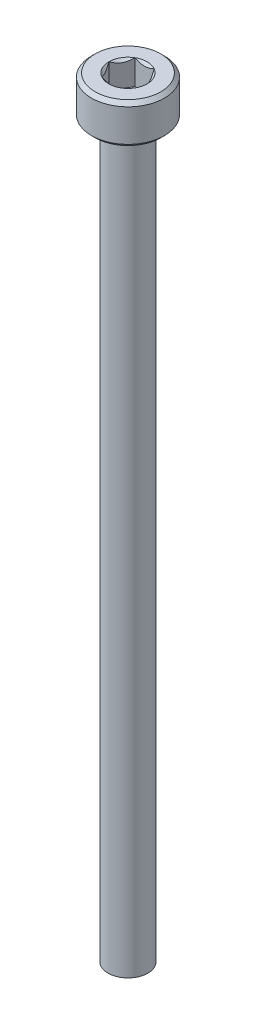
ISO-10303-21;
HEADER;
FILE_DESCRIPTION(('STEP AP214'),'2;1');
FILE_NAME('part.step','',(''),(''),'','','');
FILE_SCHEMA(('AUTOMOTIVE_DESIGN { 1 0 10303 214 1 1 1 1 }'));
ENDSEC;
DATA;
#1=APPLICATION_CONTEXT('core data for automotive mechanical design processes');
#2=APPLICATION_PROTOCOL_DEFINITION('international standard','automotive_design',2000,#1);
#3=PRODUCT_CONTEXT('',#1,'mechanical');
#4=PRODUCT('Part','Part','',(#3));
#5=PRODUCT_RELATED_PRODUCT_CATEGORY('part','',(#4));
#6=PRODUCT_DEFINITION_FORMATION('','',#4);
#7=PRODUCT_DEFINITION_CONTEXT('part definition',#1,'design');
#8=PRODUCT_DEFINITION('design','',#6,#7);
#9=PRODUCT_DEFINITION_SHAPE('','',#8);
#10=(LENGTH_UNIT() NAMED_UNIT(*) SI_UNIT(.MILLI.,.METRE.));
#11=(NAMED_UNIT(*) PLANE_ANGLE_UNIT() SI_UNIT($,.RADIAN.));
#12=(NAMED_UNIT(*) SI_UNIT($,.STERADIAN.) SOLID_ANGLE_UNIT());
#13=UNCERTAINTY_MEASURE_WITH_UNIT(LENGTH_MEASURE(1.E-05),#10,'distance_accuracy_value','');
#14=(GEOMETRIC_REPRESENTATION_CONTEXT(3) GLOBAL_UNCERTAINTY_ASSIGNED_CONTEXT((#13)) GLOBAL_UNIT_ASSIGNED_CONTEXT((#10,
#11,#12)) REPRESENTATION_CONTEXT('',''));
#15=CARTESIAN_POINT('',(0.,0.,0.));
#16=DIRECTION('',(0.,0.,1.));
#17=DIRECTION('',(1.,0.,0.));
#18=AXIS2_PLACEMENT_3D('',#15,#16,#17);
#19=CARTESIAN_POINT('',(0.,3.,0.));
#20=DIRECTION('',(0.,-1.,0.));
#21=DIRECTION('',(0.,0.,-1.));
#22=AXIS2_PLACEMENT_3D('',#19,#20,#21);
#23=CYLINDRICAL_SURFACE('',#22,2.75);
#24=CARTESIAN_POINT('',(0.,0.275000000000001,0.));
#25=DIRECTION('',(0.,1.,0.));
#26=DIRECTION('',(0.,0.,1.));
#27=AXIS2_PLACEMENT_3D('',#24,#25,#26);
#28=CIRCLE('',#27,2.75);
#29=CARTESIAN_POINT('',(0.,0.275000000000001,2.75));
#30=VERTEX_POINT('',#29);
#31=EDGE_CURVE('E222',#30,#30,#28,.T.);
#32=ORIENTED_EDGE('',*,*,#31,.T.);
#33=EDGE_LOOP('',(#32));
#34=FACE_BOUND('',#33,.T.);
#35=CARTESIAN_POINT('',(0.,2.725,0.));
#36=DIRECTION('',(0.,1.,0.));
#37=DIRECTION('',(0.,0.,1.));
#38=AXIS2_PLACEMENT_3D('',#35,#36,#37);
#39=CIRCLE('',#38,2.75);
#40=CARTESIAN_POINT('',(0.,2.725,2.75));
#41=VERTEX_POINT('',#40);
#42=EDGE_CURVE('E105',#41,#41,#39,.F.);
#43=ORIENTED_EDGE('',*,*,#42,.T.);
#44=EDGE_LOOP('',(#43));
#45=FACE_BOUND('',#44,.T.);
#46=ADVANCED_FACE('F33',(#34,#45),#23,.T.);
#47=CARTESIAN_POINT('',(0.,3.,0.));
#48=DIRECTION('',(0.,1.,0.));
#49=DIRECTION('',(0.,0.,1.));
#50=AXIS2_PLACEMENT_3D('',#47,#48,#49);
#51=PLANE('',#50);
#52=CARTESIAN_POINT('',(0.,3.,0.));
#53=DIRECTION('',(0.,1.,0.));
#54=DIRECTION('',(0.,0.,1.));
#55=AXIS2_PLACEMENT_3D('',#52,#53,#54);
#56=CIRCLE('',#55,2.475);
#57=CARTESIAN_POINT('',(0.,3.,2.475));
#58=VERTEX_POINT('',#57);
#59=EDGE_CURVE('E37',#58,#58,#56,.T.);
#60=ORIENTED_EDGE('',*,*,#59,.T.);
#61=EDGE_LOOP('',(#60));
#62=FACE_BOUND('',#61,.T.);
#63=CARTESIAN_POINT('',(0.,3.,0.));
#64=DIRECTION('',(0.,1.,0.));
#65=DIRECTION('',(0.,0.,1.));
#66=AXIS2_PLACEMENT_3D('',#63,#64,#65);
#67=CIRCLE('',#66,1.44337567297406);
#68=CARTESIAN_POINT('',(0.721687836487033,3.,1.25));
#69=VERTEX_POINT('',#68);
#70=CARTESIAN_POINT('',(1.44337567297406,3.,0.));
#71=VERTEX_POINT('',#70);
#72=EDGE_CURVE('E48',#69,#71,#67,.T.);
#73=ORIENTED_EDGE('',*,*,#72,.F.);
#74=CARTESIAN_POINT('',(-0.721687836487033,3.,1.25));
#75=VERTEX_POINT('',#74);
#76=EDGE_CURVE('E55',#75,#69,#67,.T.);
#77=ORIENTED_EDGE('',*,*,#76,.F.);
#78=CARTESIAN_POINT('',(-1.44337567297406,3.,0.));
#79=VERTEX_POINT('',#78);
#80=EDGE_CURVE('E128',#79,#75,#67,.T.);
#81=ORIENTED_EDGE('',*,*,#80,.F.);
#82=CARTESIAN_POINT('',(-0.721687836487033,3.,-1.25));
#83=VERTEX_POINT('',#82);
#84=EDGE_CURVE('E127',#83,#79,#67,.T.);
#85=ORIENTED_EDGE('',*,*,#84,.F.);
#86=CARTESIAN_POINT('',(0.721687836487032,3.,-1.25));
#87=VERTEX_POINT('',#86);
#88=EDGE_CURVE('E95',#87,#83,#67,.T.);
#89=ORIENTED_EDGE('',*,*,#88,.F.);
#90=EDGE_CURVE('E87',#71,#87,#67,.T.);
#91=ORIENTED_EDGE('',*,*,#90,.F.);
#92=EDGE_LOOP('',(#73,#77,#81,#85,#89,#91));
#93=FACE_BOUND('',#92,.T.);
#94=ADVANCED_FACE('F125',(#62,#93),#51,.T.);
#95=CARTESIAN_POINT('',(0.,0.,0.));
#96=DIRECTION('',(0.,1.,0.));
#97=DIRECTION('',(0.,0.,1.));
#98=AXIS2_PLACEMENT_3D('',#95,#96,#97);
#99=PLANE('',#98);
#100=CARTESIAN_POINT('',(0.,0.,0.));
#101=DIRECTION('',(0.,-1.,0.));
#102=DIRECTION('',(0.,0.,-1.));
#103=AXIS2_PLACEMENT_3D('',#100,#101,#102);
#104=CIRCLE('',#103,1.5);
#105=CARTESIAN_POINT('',(0.,0.,-1.5));
#106=VERTEX_POINT('',#105);
#107=EDGE_CURVE('E11',#106,#106,#104,.T.);
#108=ORIENTED_EDGE('',*,*,#107,.F.);
#109=EDGE_LOOP('',(#108));
#110=FACE_BOUND('',#109,.T.);
#111=CARTESIAN_POINT('',(0.,0.,0.));
#112=DIRECTION('',(0.,1.,0.));
#113=DIRECTION('',(0.,0.,1.));
#114=AXIS2_PLACEMENT_3D('',#111,#112,#113);
#115=CIRCLE('',#114,2.475);
#116=CARTESIAN_POINT('',(0.,0.,2.475));
#117=VERTEX_POINT('',#116);
#118=EDGE_CURVE('E220',#117,#117,#115,.F.);
#119=ORIENTED_EDGE('',*,*,#118,.T.);
#120=EDGE_LOOP('',(#119));
#121=FACE_BOUND('',#120,.T.);
#122=ADVANCED_FACE('F203',(#110,#121),#99,.F.);
#123=CARTESIAN_POINT('',(0.,3.,0.));
#124=DIRECTION('',(0.,1.,0.));
#125=DIRECTION('',(0.,0.,1.));
#126=AXIS2_PLACEMENT_3D('',#123,#124,#125);
#127=CONICAL_SURFACE('',#126,1.44337567297406,0.78539816339745);
#128=ORIENTED_EDGE('',*,*,#88,.T.);
#129=CARTESIAN_POINT('',(-1.43934010808077,3.46298209689233,-1.25));
#130=CARTESIAN_POINT('',(-1.40429313005659,3.43652492263289,-1.25));
#131=CARTESIAN_POINT('',(-1.36905087135599,3.41032716035428,-1.25));
#132=CARTESIAN_POINT('',(-1.29809650706311,3.35855757183958,-1.25));
#133=CARTESIAN_POINT('',(-1.26238428576495,3.33298590435629,-1.25));
#134=CARTESIAN_POINT('',(-1.15390111792708,3.25700599368946,-1.25));
#135=CARTESIAN_POINT('',(-1.08031646726264,3.20774028618957,-1.25));
#136=CARTESIAN_POINT('',(-0.926012322755095,3.11102583026313,-1.25));
#137=CARTESIAN_POINT('',(-0.845125318656146,3.0638412989418,-1.25));
#138=CARTESIAN_POINT('',(-0.679311174076602,2.97753073439041,-1.25));
#139=CARTESIAN_POINT('',(-0.594398891026688,2.9383775346269,-1.25));
#140=CARTESIAN_POINT('',(-0.466944812460741,2.89047722368829,-1.25));
#141=CARTESIAN_POINT('',(-0.426289985812822,2.87672948978634,-1.25));
#142=CARTESIAN_POINT('',(-0.343998850091268,2.85249792745054,-1.25));
#143=CARTESIAN_POINT('',(-0.302362473614962,2.84201432386977,-1.25));
#144=CARTESIAN_POINT('',(-0.219052696285666,2.8250301617483,-1.25));
#145=CARTESIAN_POINT('',(-0.1773934284745,2.81846136047137,-1.25));
#146=CARTESIAN_POINT('',(-0.0936293693401924,2.80943505345776,-1.25));
#147=CARTESIAN_POINT('',(-0.0515246558543963,2.80697684099727,-1.25));
#148=CARTESIAN_POINT('',(0.0311890576306314,2.80635406201328,-1.25));
#149=CARTESIAN_POINT('',(0.0717969625499302,2.80803711684625,-1.25));
#150=CARTESIAN_POINT('',(0.152668636885197,2.81526827059791,-1.25));
#151=CARTESIAN_POINT('',(0.192932338835358,2.82081711041311,-1.25));
#152=CARTESIAN_POINT('',(0.273499879165295,2.83557103646495,-1.25));
#153=CARTESIAN_POINT('',(0.313792180618511,2.8448381759641,-1.25));
#154=CARTESIAN_POINT('',(0.393496413911457,2.86653617845735,-1.25));
#155=CARTESIAN_POINT('',(0.432908419115059,2.87896677673064,-1.25));
#156=CARTESIAN_POINT('',(0.556992735862298,2.92277935293144,-1.25));
#157=CARTESIAN_POINT('',(0.639898924666085,2.95915107287596,-1.25));
#158=CARTESIAN_POINT('',(0.801816555499701,3.04001916217833,-1.25));
#159=CARTESIAN_POINT('',(0.880812666325045,3.08454472091199,-1.25));
#160=CARTESIAN_POINT('',(1.0317856127975,3.17640487666662,-1.25));
#161=CARTESIAN_POINT('',(1.10391618485086,3.22348993391625,-1.25));
#162=CARTESIAN_POINT('',(1.21018606043311,3.29627856159854,-1.25));
#163=CARTESIAN_POINT('',(1.24515069969379,3.32079808539336,-1.25));
#164=CARTESIAN_POINT('',(1.31460220852736,3.37048563676568,-1.25));
#165=CARTESIAN_POINT('',(1.34908920596618,3.39565348541552,-1.25));
#166=CARTESIAN_POINT('',(1.38337731682912,3.42109014884121,-1.25));
#167=B_SPLINE_CURVE_WITH_KNOTS('',3,(#129,#130,#131,#132,#133,#134,#135,#136,#137,#138,#139,
#140,#141,#142,#143,#144,#145,#146,#147,#148,#149,#150,#151,#152,#153,#154,#155,#156,#157,#158,
#159,#160,#161,#162,#163,#164,#165,#166),.UNSPECIFIED.,.F.,.F.,(4,2,2,2,2,2,2,2,2,2,2,2,2,2,2,2,
2,2,4),(0.,0.131732960381448,0.263498984161645,0.529042014455825,0.809741926134617,
1.08947609717225,1.21811634272576,1.346765447839,1.47310084517844,1.59941451973784,
1.72115042167849,1.84290966131735,1.96679153905341,2.09066305366039,2.36146692896009,
2.63325989198491,2.89154668212279,3.01965734507713,3.14773302245628),.UNSPECIFIED.);
#168=EDGE_CURVE('E100',#87,#83,#167,.F.);
#169=ORIENTED_EDGE('',*,*,#168,.F.);
#170=EDGE_LOOP('',(#128,#169));
#171=FACE_BOUND('',#170,.T.);
#172=ADVANCED_FACE('F101',(#171),#127,.F.);
#173=ORIENTED_EDGE('',*,*,#84,.T.);
#174=CARTESIAN_POINT('',(-0.721572366433195,3.00011548390914,-1.2502));
#175=CARTESIAN_POINT('',(-0.746384090710444,2.9753216680551,-1.20722483292841));
#176=CARTESIAN_POINT('',(-0.771610739653664,2.95198373441868,-1.16353099525405));
#177=CARTESIAN_POINT('',(-0.823050873919155,2.90925200408454,-1.07443406915806));
#178=CARTESIAN_POINT('',(-0.849269254648333,2.88988199236041,-1.02902250164294));
#179=CARTESIAN_POINT('',(-0.902137405038635,2.85670048341348,-0.937452179064741));
#180=CARTESIAN_POINT('',(-0.928773701756387,2.84280555905266,-0.891316759824115));
#181=CARTESIAN_POINT('',(-0.982632884076012,2.82139728216064,-0.798029919592408));
#182=CARTESIAN_POINT('',(-1.00985412292348,2.81386794156679,-0.750881350863621));
#183=CARTESIAN_POINT('',(-1.05676666578643,2.8070744980507,-0.669626443112748));
#184=CARTESIAN_POINT('',(-1.07639733689152,2.80606855910435,-0.63562512337206));
#185=CARTESIAN_POINT('',(-1.11562418145499,2.80776141491132,-0.567682235567523));
#186=CARTESIAN_POINT('',(-1.1352203463451,2.81046102721554,-0.533740682344343));
#187=CARTESIAN_POINT('',(-1.1742235548576,2.81940893031638,-0.466185143542501));
#188=CARTESIAN_POINT('',(-1.19363040521233,2.82566052589971,-0.432571492713226));
#189=CARTESIAN_POINT('',(-1.23212011385119,2.8413756814139,-0.365905361782188));
#190=CARTESIAN_POINT('',(-1.2512028293628,2.85084062008746,-0.332853128969705));
#191=CARTESIAN_POINT('',(-1.30007715810653,2.87893139068759,-0.248200308399736));
#192=CARTESIAN_POINT('',(-1.32956058931202,2.8996701574522,-0.197133507570362));
#193=CARTESIAN_POINT('',(-1.38737318998519,2.94638713467148,-0.0969991458867452));
#194=CARTESIAN_POINT('',(-1.41570576386268,2.97234829594677,-0.0479256884217304));
#195=CARTESIAN_POINT('',(-1.4434911430279,3.00011548390914,0.000200000000000358));
#196=B_SPLINE_CURVE_WITH_KNOTS('',3,(#174,#175,#176,#177,#178,#179,#180,#181,#182,#183,#184,
#185,#186,#187,#188,#189,#190,#191,#192,#193,#194,#195),.UNSPECIFIED.,.F.,.F.,(4,2,2,2,2,2,2,2,
2,2,4),(0.,0.166533409618303,0.334037607289761,0.498880396489697,0.663307919240274,
0.780963963458826,0.898645970148452,1.01643764860773,1.13427993171549,1.32148652032141,
1.50809158792574),.UNSPECIFIED.);
#197=EDGE_CURVE('E130',#83,#79,#196,.T.);
#198=ORIENTED_EDGE('',*,*,#197,.F.);
#199=EDGE_LOOP('',(#173,#198));
#200=FACE_BOUND('',#199,.T.);
#201=ADVANCED_FACE('F237',(#200),#127,.F.);
#202=ORIENTED_EDGE('',*,*,#80,.T.);
#203=CARTESIAN_POINT('',(-1.4434911430279,3.00011548390914,-0.000199999999999785));
#204=CARTESIAN_POINT('',(-1.41867941875065,2.9753216680551,0.0427751670715869));
#205=CARTESIAN_POINT('',(-1.39345276980743,2.95198373441868,0.0864690047459481));
#206=CARTESIAN_POINT('',(-1.34201263554194,2.90925200408454,0.175565930841942));
#207=CARTESIAN_POINT('',(-1.31579425481276,2.88988199236041,0.220977498357064));
#208=CARTESIAN_POINT('',(-1.26292610442246,2.85670048341348,0.31254782093526));
#209=CARTESIAN_POINT('',(-1.23628980770471,2.84280555905266,0.358683240175886));
#210=CARTESIAN_POINT('',(-1.18243062538508,2.82139728216064,0.451970080407593));
#211=CARTESIAN_POINT('',(-1.15520938653761,2.81386794156679,0.49911864913638));
#212=CARTESIAN_POINT('',(-1.10829684367467,2.8070744980507,0.580373556887253));
#213=CARTESIAN_POINT('',(-1.08866617256958,2.80606855910435,0.614374876627941));
#214=CARTESIAN_POINT('',(-1.04943932800611,2.80776141491132,0.682317764432478));
#215=CARTESIAN_POINT('',(-1.02984316311599,2.81046102721554,0.716259317655658));
#216=CARTESIAN_POINT('',(-0.990839954603499,2.81940893031638,0.7838148564575));
#217=CARTESIAN_POINT('',(-0.971433104248771,2.82566052589971,0.817428507286775));
#218=CARTESIAN_POINT('',(-0.932943395609905,2.8413756814139,0.884094638217813));
#219=CARTESIAN_POINT('',(-0.9138606800983,2.85084062008746,0.917146871030296));
#220=CARTESIAN_POINT('',(-0.864986351354568,2.87893139068759,1.00179969160026));
#221=CARTESIAN_POINT('',(-0.835502920149076,2.8996701574522,1.05286649242964));
#222=CARTESIAN_POINT('',(-0.777690319475909,2.94638713467148,1.15300085411325));
#223=CARTESIAN_POINT('',(-0.749357745598417,2.97234829594677,1.20207431157827));
#224=CARTESIAN_POINT('',(-0.721572366433195,3.00011548390914,1.2502));
#225=B_SPLINE_CURVE_WITH_KNOTS('',3,(#203,#204,#205,#206,#207,#208,#209,#210,#211,#212,#213,
#214,#215,#216,#217,#218,#219,#220,#221,#222,#223,#224),.UNSPECIFIED.,.F.,.F.,(4,2,2,2,2,2,2,2,
2,2,4),(0.,0.166533409618303,0.334037607289761,0.498880396489698,0.663307919240275,
0.780963963458827,0.898645970148453,1.01643764860773,1.1342799317155,1.32148652032141,
1.50809158792573),.UNSPECIFIED.);
#226=EDGE_CURVE('E139',#79,#75,#225,.T.);
#227=ORIENTED_EDGE('',*,*,#226,.F.);
#228=EDGE_LOOP('',(#202,#227));
#229=FACE_BOUND('',#228,.T.);
#230=ADVANCED_FACE('F252',(#229),#127,.F.);
#231=ORIENTED_EDGE('',*,*,#76,.T.);
#232=CARTESIAN_POINT('',(-1.43934010808077,3.46298209689233,1.25));
#233=CARTESIAN_POINT('',(-1.40429313005659,3.43652492263289,1.25));
#234=CARTESIAN_POINT('',(-1.36905087135599,3.41032716035428,1.25));
#235=CARTESIAN_POINT('',(-1.29809650706311,3.35855757183958,1.25));
#236=CARTESIAN_POINT('',(-1.26238428576495,3.33298590435629,1.25));
#237=CARTESIAN_POINT('',(-1.15390111792708,3.25700599368946,1.25));
#238=CARTESIAN_POINT('',(-1.08031646726264,3.20774028618957,1.25));
#239=CARTESIAN_POINT('',(-0.926012322755096,3.11102583026313,1.25));
#240=CARTESIAN_POINT('',(-0.845125318656147,3.0638412989418,1.25));
#241=CARTESIAN_POINT('',(-0.679311174076603,2.97753073439041,1.25));
#242=CARTESIAN_POINT('',(-0.594398891026688,2.9383775346269,1.25));
#243=CARTESIAN_POINT('',(-0.46694481246074,2.89047722368829,1.25));
#244=CARTESIAN_POINT('',(-0.426289985812822,2.87672948978634,1.25));
#245=CARTESIAN_POINT('',(-0.343998850091268,2.85249792745054,1.25));
#246=CARTESIAN_POINT('',(-0.302362473614962,2.84201432386977,1.25));
#247=CARTESIAN_POINT('',(-0.219052696285665,2.8250301617483,1.25));
#248=CARTESIAN_POINT('',(-0.1773934284745,2.81846136047137,1.25));
#249=CARTESIAN_POINT('',(-0.0936293693401921,2.80943505345776,1.25));
#250=CARTESIAN_POINT('',(-0.051524655854396,2.80697684099727,1.25));
#251=CARTESIAN_POINT('',(0.0311890576306315,2.80635406201328,1.25));
#252=CARTESIAN_POINT('',(0.0717969625499303,2.80803711684625,1.25));
#253=CARTESIAN_POINT('',(0.152668636885197,2.81526827059791,1.25));
#254=CARTESIAN_POINT('',(0.192932338835358,2.82081711041311,1.25));
#255=CARTESIAN_POINT('',(0.273499879165295,2.83557103646495,1.25));
#256=CARTESIAN_POINT('',(0.313792180618511,2.8448381759641,1.25));
#257=CARTESIAN_POINT('',(0.393496413911457,2.86653617845735,1.25));
#258=CARTESIAN_POINT('',(0.432908419115059,2.87896677673064,1.25));
#259=CARTESIAN_POINT('',(0.556992735862298,2.92277935293144,1.25));
#260=CARTESIAN_POINT('',(0.639898924666085,2.95915107287595,1.25));
#261=CARTESIAN_POINT('',(0.801816555499701,3.04001916217833,1.25));
#262=CARTESIAN_POINT('',(0.880812666325044,3.08454472091198,1.25));
#263=CARTESIAN_POINT('',(1.0317856127975,3.17640487666662,1.25));
#264=CARTESIAN_POINT('',(1.10391618485086,3.22348993391625,1.25));
#265=CARTESIAN_POINT('',(1.2101860604331,3.29627856159854,1.25));
#266=CARTESIAN_POINT('',(1.24515069969379,3.32079808539336,1.25));
#267=CARTESIAN_POINT('',(1.31460220852736,3.37048563676568,1.25));
#268=CARTESIAN_POINT('',(1.34908920596618,3.39565348541552,1.25));
#269=CARTESIAN_POINT('',(1.38337731682911,3.42109014884121,1.25));
#270=B_SPLINE_CURVE_WITH_KNOTS('',3,(#232,#233,#234,#235,#236,#237,#238,#239,#240,#241,#242,
#243,#244,#245,#246,#247,#248,#249,#250,#251,#252,#253,#254,#255,#256,#257,#258,#259,#260,#261,
#262,#263,#264,#265,#266,#267,#268,#269),.UNSPECIFIED.,.F.,.F.,(4,2,2,2,2,2,2,2,2,2,2,2,2,2,2,2,
2,2,4),(0.,0.131732960381448,0.263498984161645,0.529042014455826,0.809741926134619,
1.08947609717225,1.21811634272577,1.34676544783901,1.47310084517844,1.59941451973785,
1.7211504216785,1.84290966131735,1.96679153905342,2.09066305366039,2.36146692896009,
2.63325989198491,2.89154668212279,3.01965734507713,3.14773302245628),.UNSPECIFIED.);
#271=EDGE_CURVE('E166',#75,#69,#270,.T.);
#272=ORIENTED_EDGE('',*,*,#271,.F.);
#273=EDGE_LOOP('',(#231,#272));
#274=FACE_BOUND('',#273,.T.);
#275=ADVANCED_FACE('F282',(#274),#127,.F.);
#276=ORIENTED_EDGE('',*,*,#72,.T.);
#277=CARTESIAN_POINT('',(0.721572366433194,3.00011548390914,1.2502));
#278=CARTESIAN_POINT('',(0.746384090710444,2.9753216680551,1.20722483292841));
#279=CARTESIAN_POINT('',(0.771610739653664,2.95198373441868,1.16353099525405));
#280=CARTESIAN_POINT('',(0.823050873919154,2.90925200408454,1.07443406915806));
#281=CARTESIAN_POINT('',(0.849269254648333,2.88988199236041,1.02902250164294));
#282=CARTESIAN_POINT('',(0.902137405038635,2.85670048341348,0.93745217906474));
#283=CARTESIAN_POINT('',(0.928773701756386,2.84280555905266,0.891316759824115));
#284=CARTESIAN_POINT('',(0.982632884076012,2.82139728216064,0.798029919592408));
#285=CARTESIAN_POINT('',(1.00985412292348,2.81386794156679,0.750881350863621));
#286=CARTESIAN_POINT('',(1.05676666578643,2.8070744980507,0.669626443112748));
#287=CARTESIAN_POINT('',(1.07639733689152,2.80606855910435,0.63562512337206));
#288=CARTESIAN_POINT('',(1.11562418145499,2.80776141491132,0.567682235567523));
#289=CARTESIAN_POINT('',(1.1352203463451,2.81046102721554,0.533740682344343));
#290=CARTESIAN_POINT('',(1.1742235548576,2.81940893031638,0.466185143542501));
#291=CARTESIAN_POINT('',(1.19363040521232,2.8256605258997,0.432571492713226));
#292=CARTESIAN_POINT('',(1.23212011385119,2.8413756814139,0.365905361782188));
#293=CARTESIAN_POINT('',(1.2512028293628,2.85084062008746,0.332853128969705));
#294=CARTESIAN_POINT('',(1.30007715810653,2.87893139068759,0.248200308399736));
#295=CARTESIAN_POINT('',(1.32956058931202,2.8996701574522,0.197133507570362));
#296=CARTESIAN_POINT('',(1.38737318998519,2.94638713467148,0.096999145886745));
#297=CARTESIAN_POINT('',(1.41570576386268,2.97234829594677,0.04792568842173));
#298=CARTESIAN_POINT('',(1.4434911430279,3.00011548390914,-0.000200000000000782));
#299=B_SPLINE_CURVE_WITH_KNOTS('',3,(#277,#278,#279,#280,#281,#282,#283,#284,#285,#286,#287,
#288,#289,#290,#291,#292,#293,#294,#295,#296,#297,#298),.UNSPECIFIED.,.F.,.F.,(4,2,2,2,2,2,2,2,
2,2,4),(0.,0.166533409618303,0.334037607289761,0.498880396489697,0.663307919240274,
0.780963963458826,0.898645970148452,1.01643764860773,1.13427993171549,1.32148652032141,
1.50809158792574),.UNSPECIFIED.);
#300=EDGE_CURVE('E115',#69,#71,#299,.T.);
#301=ORIENTED_EDGE('',*,*,#300,.F.);
#302=EDGE_LOOP('',(#276,#301));
#303=FACE_BOUND('',#302,.T.);
#304=ADVANCED_FACE('F153',(#303),#127,.F.);
#305=ORIENTED_EDGE('',*,*,#90,.T.);
#306=CARTESIAN_POINT('',(1.4434911430279,3.00011548390914,0.000199999999999333));
#307=CARTESIAN_POINT('',(1.41867941875065,2.9753216680551,-0.0427751670715874));
#308=CARTESIAN_POINT('',(1.39345276980743,2.95198373441868,-0.0864690047459486));
#309=CARTESIAN_POINT('',(1.34201263554194,2.90925200408454,-0.175565930841942));
#310=CARTESIAN_POINT('',(1.31579425481276,2.88988199236041,-0.220977498357064));
#311=CARTESIAN_POINT('',(1.26292610442246,2.85670048341348,-0.31254782093526));
#312=CARTESIAN_POINT('',(1.23628980770471,2.84280555905266,-0.358683240175886));
#313=CARTESIAN_POINT('',(1.18243062538508,2.82139728216064,-0.451970080407593));
#314=CARTESIAN_POINT('',(1.15520938653761,2.81386794156679,-0.49911864913638));
#315=CARTESIAN_POINT('',(1.10829684367467,2.8070744980507,-0.580373556887252));
#316=CARTESIAN_POINT('',(1.08866617256958,2.80606855910435,-0.614374876627941));
#317=CARTESIAN_POINT('',(1.04943932800611,2.80776141491132,-0.682317764432477));
#318=CARTESIAN_POINT('',(1.02984316311599,2.81046102721554,-0.716259317655657));
#319=CARTESIAN_POINT('',(0.990839954603499,2.81940893031638,-0.783814856457499));
#320=CARTESIAN_POINT('',(0.971433104248771,2.82566052589971,-0.817428507286775));
#321=CARTESIAN_POINT('',(0.932943395609905,2.8413756814139,-0.884094638217813));
#322=CARTESIAN_POINT('',(0.9138606800983,2.85084062008746,-0.917146871030295));
#323=CARTESIAN_POINT('',(0.864986351354567,2.87893139068759,-1.00179969160026));
#324=CARTESIAN_POINT('',(0.835502920149075,2.8996701574522,-1.05286649242964));
#325=CARTESIAN_POINT('',(0.777690319475908,2.94638713467148,-1.15300085411326));
#326=CARTESIAN_POINT('',(0.749357745598416,2.97234829594677,-1.20207431157827));
#327=CARTESIAN_POINT('',(0.721572366433194,3.00011548390914,-1.2502));
#328=B_SPLINE_CURVE_WITH_KNOTS('',3,(#306,#307,#308,#309,#310,#311,#312,#313,#314,#315,#316,
#317,#318,#319,#320,#321,#322,#323,#324,#325,#326,#327),.UNSPECIFIED.,.F.,.F.,(4,2,2,2,2,2,2,2,
2,2,4),(0.,0.166533409618303,0.334037607289761,0.498880396489698,0.663307919240274,
0.780963963458826,0.898645970148452,1.01643764860773,1.13427993171549,1.32148652032141,
1.50809158792574),.UNSPECIFIED.);
#329=EDGE_CURVE('E91',#71,#87,#328,.T.);
#330=ORIENTED_EDGE('',*,*,#329,.F.);
#331=EDGE_LOOP('',(#305,#330));
#332=FACE_BOUND('',#331,.T.);
#333=ADVANCED_FACE('F89',(#332),#127,.F.);
#334=CARTESIAN_POINT('',(0.,1.12,0.));
#335=DIRECTION('',(0.,1.,0.));
#336=DIRECTION('',(0.,0.,1.));
#337=AXIS2_PLACEMENT_3D('',#334,#335,#336);
#338=PLANE('',#337);
#339=DIRECTION('',(-0.5,0.,-0.866025403784438));
#340=VECTOR('',#339,1.);
#341=CARTESIAN_POINT('',(1.44337567297406,1.12,0.));
#342=LINE('',#341,#340);
#343=CARTESIAN_POINT('',(1.44337567297406,1.12,0.));
#344=VERTEX_POINT('',#343);
#345=CARTESIAN_POINT('',(0.721687836487032,1.12,-1.25));
#346=VERTEX_POINT('',#345);
#347=EDGE_CURVE('E114',#344,#346,#342,.T.);
#348=ORIENTED_EDGE('',*,*,#347,.T.);
#349=DIRECTION('',(-1.,0.,0.));
#350=VECTOR('',#349,1.);
#351=CARTESIAN_POINT('',(0.721687836487032,1.12,-1.25));
#352=LINE('',#351,#350);
#353=CARTESIAN_POINT('',(-0.721687836487032,1.12,-1.25));
#354=VERTEX_POINT('',#353);
#355=EDGE_CURVE('E119',#346,#354,#352,.T.);
#356=ORIENTED_EDGE('',*,*,#355,.T.);
#357=DIRECTION('',(-0.5,0.,0.866025403784439));
#358=VECTOR('',#357,1.);
#359=CARTESIAN_POINT('',(-0.721687836487032,1.12,-1.25));
#360=LINE('',#359,#358);
#361=CARTESIAN_POINT('',(-1.44337567297406,1.12,0.));
#362=VERTEX_POINT('',#361);
#363=EDGE_CURVE('E276',#354,#362,#360,.T.);
#364=ORIENTED_EDGE('',*,*,#363,.T.);
#365=DIRECTION('',(0.5,0.,0.866025403784439));
#366=VECTOR('',#365,1.);
#367=CARTESIAN_POINT('',(-1.44337567297406,1.12,0.));
#368=LINE('',#367,#366);
#369=CARTESIAN_POINT('',(-0.721687836487033,1.12,1.25));
#370=VERTEX_POINT('',#369);
#371=EDGE_CURVE('E259',#362,#370,#368,.T.);
#372=ORIENTED_EDGE('',*,*,#371,.T.);
#373=DIRECTION('',(1.,0.,0.));
#374=VECTOR('',#373,1.);
#375=CARTESIAN_POINT('',(-0.721687836487033,1.12,1.25));
#376=LINE('',#375,#374);
#377=CARTESIAN_POINT('',(0.721687836487032,1.12,1.25));
#378=VERTEX_POINT('',#377);
#379=EDGE_CURVE('E272',#370,#378,#376,.T.);
#380=ORIENTED_EDGE('',*,*,#379,.T.);
#381=DIRECTION('',(0.5,0.,-0.866025403784439));
#382=VECTOR('',#381,1.);
#383=CARTESIAN_POINT('',(0.721687836487032,1.12,1.25));
#384=LINE('',#383,#382);
#385=EDGE_CURVE('E122',#378,#344,#384,.T.);
#386=ORIENTED_EDGE('',*,*,#385,.T.);
#387=EDGE_LOOP('',(#348,#356,#364,#372,#380,#386));
#388=FACE_BOUND('',#387,.T.);
#389=ADVANCED_FACE('F152',(#388),#338,.T.);
#390=CARTESIAN_POINT('',(0.721687836487032,1.12,-1.25));
#391=DIRECTION('',(0.,0.,-1.));
#392=DIRECTION('',(-1.,0.,0.));
#393=AXIS2_PLACEMENT_3D('',#390,#391,#392);
#394=PLANE('',#393);
#395=DIRECTION('',(0.,1.,0.));
#396=VECTOR('',#395,1.);
#397=CARTESIAN_POINT('',(0.721687836487032,1.12,-1.25));
#398=LINE('',#397,#396);
#399=EDGE_CURVE('E112',#346,#87,#398,.T.);
#400=ORIENTED_EDGE('',*,*,#399,.T.);
#401=ORIENTED_EDGE('',*,*,#168,.T.);
#402=DIRECTION('',(0.,1.,0.));
#403=VECTOR('',#402,1.);
#404=CARTESIAN_POINT('',(-0.721687836487032,1.12,-1.25));
#405=LINE('',#404,#403);
#406=EDGE_CURVE('E121',#354,#83,#405,.T.);
#407=ORIENTED_EDGE('',*,*,#406,.F.);
#408=ORIENTED_EDGE('',*,*,#355,.F.);
#409=EDGE_LOOP('',(#400,#401,#407,#408));
#410=FACE_BOUND('',#409,.T.);
#411=ADVANCED_FACE('F117',(#410),#394,.F.);
#412=CARTESIAN_POINT('',(-0.721687836487032,1.12,-1.25));
#413=DIRECTION('',(-0.866025403784439,0.,-0.5));
#414=DIRECTION('',(-0.5,0.,0.866025403784439));
#415=AXIS2_PLACEMENT_3D('',#412,#413,#414);
#416=PLANE('',#415);
#417=ORIENTED_EDGE('',*,*,#406,.T.);
#418=ORIENTED_EDGE('',*,*,#197,.T.);
#419=DIRECTION('',(0.,1.,0.));
#420=VECTOR('',#419,1.);
#421=CARTESIAN_POINT('',(-1.44337567297406,1.12,0.));
#422=LINE('',#421,#420);
#423=EDGE_CURVE('E255',#362,#79,#422,.T.);
#424=ORIENTED_EDGE('',*,*,#423,.F.);
#425=ORIENTED_EDGE('',*,*,#363,.F.);
#426=EDGE_LOOP('',(#417,#418,#424,#425));
#427=FACE_BOUND('',#426,.T.);
#428=ADVANCED_FACE('F145',(#427),#416,.F.);
#429=CARTESIAN_POINT('',(-1.44337567297406,1.12,0.));
#430=DIRECTION('',(-0.866025403784439,0.,0.5));
#431=DIRECTION('',(0.5,0.,0.866025403784439));
#432=AXIS2_PLACEMENT_3D('',#429,#430,#431);
#433=PLANE('',#432);
#434=ORIENTED_EDGE('',*,*,#423,.T.);
#435=ORIENTED_EDGE('',*,*,#226,.T.);
#436=DIRECTION('',(0.,1.,0.));
#437=VECTOR('',#436,1.);
#438=CARTESIAN_POINT('',(-0.721687836487033,1.12,1.25));
#439=LINE('',#438,#437);
#440=EDGE_CURVE('E261',#370,#75,#439,.T.);
#441=ORIENTED_EDGE('',*,*,#440,.F.);
#442=ORIENTED_EDGE('',*,*,#371,.F.);
#443=EDGE_LOOP('',(#434,#435,#441,#442));
#444=FACE_BOUND('',#443,.T.);
#445=ADVANCED_FACE('F187',(#444),#433,.F.);
#446=CARTESIAN_POINT('',(-0.721687836487033,1.12,1.25));
#447=DIRECTION('',(0.,0.,1.));
#448=DIRECTION('',(1.,0.,0.));
#449=AXIS2_PLACEMENT_3D('',#446,#447,#448);
#450=PLANE('',#449);
#451=ORIENTED_EDGE('',*,*,#440,.T.);
#452=ORIENTED_EDGE('',*,*,#271,.T.);
#453=DIRECTION('',(0.,1.,0.));
#454=VECTOR('',#453,1.);
#455=CARTESIAN_POINT('',(0.721687836487032,1.12,1.25));
#456=LINE('',#455,#454);
#457=EDGE_CURVE('E263',#378,#69,#456,.T.);
#458=ORIENTED_EDGE('',*,*,#457,.F.);
#459=ORIENTED_EDGE('',*,*,#379,.F.);
#460=EDGE_LOOP('',(#451,#452,#458,#459));
#461=FACE_BOUND('',#460,.T.);
#462=ADVANCED_FACE('F183',(#461),#450,.F.);
#463=CARTESIAN_POINT('',(0.721687836487032,1.12,1.25));
#464=DIRECTION('',(0.866025403784439,0.,0.5));
#465=DIRECTION('',(0.5,0.,-0.866025403784439));
#466=AXIS2_PLACEMENT_3D('',#463,#464,#465);
#467=PLANE('',#466);
#468=ORIENTED_EDGE('',*,*,#457,.T.);
#469=ORIENTED_EDGE('',*,*,#300,.T.);
#470=DIRECTION('',(0.,1.,0.));
#471=VECTOR('',#470,1.);
#472=CARTESIAN_POINT('',(1.44337567297406,1.12,0.));
#473=LINE('',#472,#471);
#474=EDGE_CURVE('E106',#344,#71,#473,.T.);
#475=ORIENTED_EDGE('',*,*,#474,.F.);
#476=ORIENTED_EDGE('',*,*,#385,.F.);
#477=EDGE_LOOP('',(#468,#469,#475,#476));
#478=FACE_BOUND('',#477,.T.);
#479=ADVANCED_FACE('F180',(#478),#467,.F.);
#480=CARTESIAN_POINT('',(1.44337567297406,1.12,0.));
#481=DIRECTION('',(0.866025403784438,0.,-0.5));
#482=DIRECTION('',(-0.5,0.,-0.866025403784439));
#483=AXIS2_PLACEMENT_3D('',#480,#481,#482);
#484=PLANE('',#483);
#485=ORIENTED_EDGE('',*,*,#474,.T.);
#486=ORIENTED_EDGE('',*,*,#329,.T.);
#487=ORIENTED_EDGE('',*,*,#399,.F.);
#488=ORIENTED_EDGE('',*,*,#347,.F.);
#489=EDGE_LOOP('',(#485,#486,#487,#488));
#490=FACE_BOUND('',#489,.T.);
#491=ADVANCED_FACE('F110',(#490),#484,.F.);
#492=CARTESIAN_POINT('',(0.,0.275000000000001,0.));
#493=DIRECTION('',(0.,1.,0.));
#494=DIRECTION('',(0.,0.,1.));
#495=AXIS2_PLACEMENT_3D('',#492,#493,#494);
#496=CONICAL_SURFACE('',#495,2.75,0.785398163397451);
#497=ORIENTED_EDGE('',*,*,#118,.F.);
#498=EDGE_LOOP('',(#497));
#499=FACE_BOUND('',#498,.T.);
#500=ORIENTED_EDGE('',*,*,#31,.F.);
#501=EDGE_LOOP('',(#500));
#502=FACE_BOUND('',#501,.T.);
#503=ADVANCED_FACE('F209',(#499,#502),#496,.T.);
#504=CARTESIAN_POINT('',(0.,3.,0.));
#505=DIRECTION('',(0.,-1.,0.));
#506=DIRECTION('',(0.,0.,-1.));
#507=AXIS2_PLACEMENT_3D('',#504,#505,#506);
#508=CONICAL_SURFACE('',#507,2.475,0.785398163397447);
#509=ORIENTED_EDGE('',*,*,#42,.F.);
#510=EDGE_LOOP('',(#509));
#511=FACE_BOUND('',#510,.T.);
#512=ORIENTED_EDGE('',*,*,#59,.F.);
#513=EDGE_LOOP('',(#512));
#514=FACE_BOUND('',#513,.T.);
#515=ADVANCED_FACE('F35',(#511,#514),#508,.T.);
#516=CARTESIAN_POINT('',(0.,-55.,0.));
#517=DIRECTION('',(0.,1.,0.));
#518=DIRECTION('',(0.,0.,1.));
#519=AXIS2_PLACEMENT_3D('',#516,#517,#518);
#520=CYLINDRICAL_SURFACE('',#519,1.5);
#521=CARTESIAN_POINT('',(0.,-55.,0.));
#522=DIRECTION('',(0.,-1.,0.));
#523=DIRECTION('',(0.,0.,-1.));
#524=AXIS2_PLACEMENT_3D('',#521,#522,#523);
#525=CIRCLE('',#524,1.5);
#526=CARTESIAN_POINT('',(0.,-55.,-1.5));
#527=VERTEX_POINT('',#526);
#528=EDGE_CURVE('E248',#527,#527,#525,.T.);
#529=ORIENTED_EDGE('',*,*,#528,.F.);
#530=EDGE_LOOP('',(#529));
#531=FACE_BOUND('',#530,.T.);
#532=ORIENTED_EDGE('',*,*,#107,.T.);
#533=EDGE_LOOP('',(#532));
#534=FACE_BOUND('',#533,.T.);
#535=ADVANCED_FACE('F154',(#531,#534),#520,.T.);
#536=CARTESIAN_POINT('',(0.,-55.,0.));
#537=DIRECTION('',(0.,-1.,0.));
#538=DIRECTION('',(0.,0.,-1.));
#539=AXIS2_PLACEMENT_3D('',#536,#537,#538);
#540=PLANE('',#539);
#541=ORIENTED_EDGE('',*,*,#528,.T.);
#542=EDGE_LOOP('',(#541));
#543=FACE_BOUND('',#542,.T.);
#544=ADVANCED_FACE('F241',(#543),#540,.T.);
#545=CLOSED_SHELL('',(#46,#94,#122,#172,#201,#230,#275,#304,#333,#389,#411,#428,#445,#462,#479,
#491,#503,#515,#535,#544));
#546=MANIFOLD_SOLID_BREP('B2',#545);
#547=ADVANCED_BREP_SHAPE_REPRESENTATION('',(#18,#546),#14);
#548=SHAPE_DEFINITION_REPRESENTATION(#9,#547);
ENDSEC;
END-ISO-10303-21;
